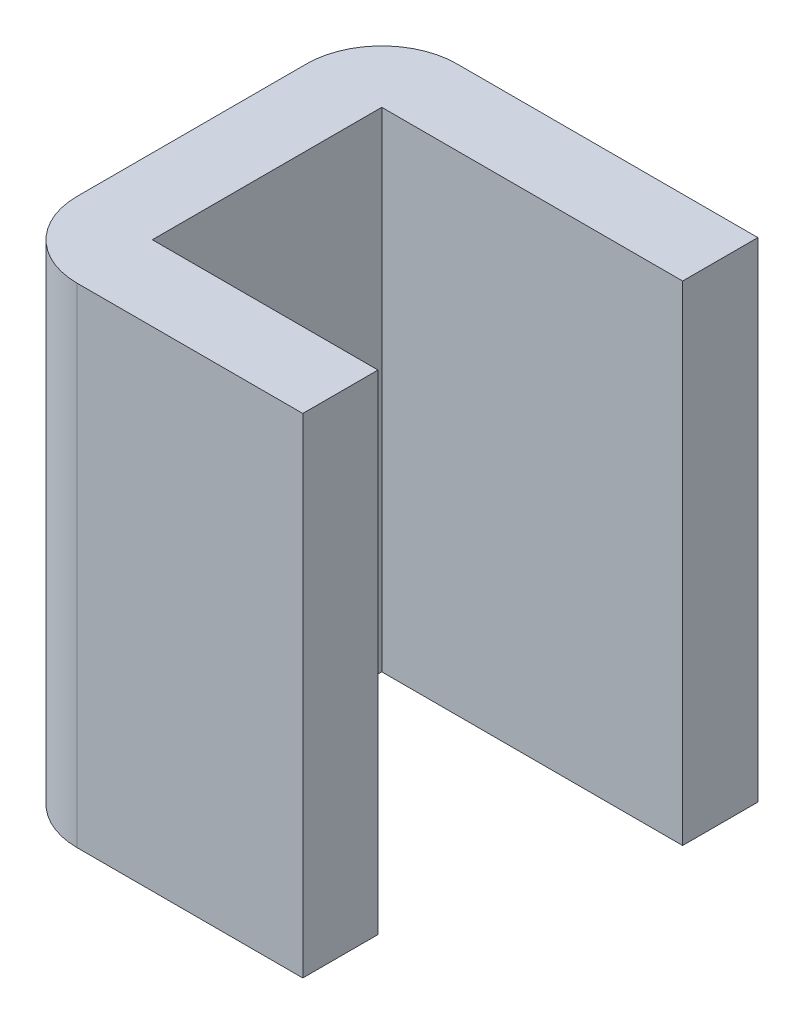
ISO-10303-21;
HEADER;
FILE_DESCRIPTION(('STEP AP214'),'2;1');
FILE_NAME('part.step','',(''),(''),'','','');
FILE_SCHEMA(('AUTOMOTIVE_DESIGN { 1 0 10303 214 1 1 1 1 }'));
ENDSEC;
DATA;
#1=APPLICATION_CONTEXT('core data for automotive mechanical design processes');
#2=APPLICATION_PROTOCOL_DEFINITION('international standard','automotive_design',2000,#1);
#3=PRODUCT_CONTEXT('',#1,'mechanical');
#4=PRODUCT('Part','Part','',(#3));
#5=PRODUCT_RELATED_PRODUCT_CATEGORY('part','',(#4));
#6=PRODUCT_DEFINITION_FORMATION('','',#4);
#7=PRODUCT_DEFINITION_CONTEXT('part definition',#1,'design');
#8=PRODUCT_DEFINITION('design','',#6,#7);
#9=PRODUCT_DEFINITION_SHAPE('','',#8);
#10=(LENGTH_UNIT() NAMED_UNIT(*) SI_UNIT(.MILLI.,.METRE.));
#11=(NAMED_UNIT(*) PLANE_ANGLE_UNIT() SI_UNIT($,.RADIAN.));
#12=(NAMED_UNIT(*) SI_UNIT($,.STERADIAN.) SOLID_ANGLE_UNIT());
#13=UNCERTAINTY_MEASURE_WITH_UNIT(LENGTH_MEASURE(1.E-05),#10,'distance_accuracy_value','');
#14=(GEOMETRIC_REPRESENTATION_CONTEXT(3) GLOBAL_UNCERTAINTY_ASSIGNED_CONTEXT((#13)) GLOBAL_UNIT_ASSIGNED_CONTEXT((#10,
#11,#12)) REPRESENTATION_CONTEXT('',''));
#15=CARTESIAN_POINT('',(0.,0.,0.));
#16=DIRECTION('',(0.,0.,1.));
#17=DIRECTION('',(1.,0.,0.));
#18=AXIS2_PLACEMENT_3D('',#15,#16,#17);
#19=CARTESIAN_POINT('',(-0.825,-0.325,0.505));
#20=DIRECTION('',(0.,0.,1.));
#21=DIRECTION('',(1.,0.,0.));
#22=AXIS2_PLACEMENT_3D('',#19,#20,#21);
#23=PLANE('',#22);
#24=DIRECTION('',(1.,0.,0.));
#25=VECTOR('',#24,1.);
#26=CARTESIAN_POINT('',(-0.625574712644,-0.325,0.505));
#27=LINE('',#26,#25);
#28=CARTESIAN_POINT('',(-0.425,-0.325,0.505));
#29=VERTEX_POINT('',#28);
#30=CARTESIAN_POINT('',(-0.725,-0.325,0.505));
#31=VERTEX_POINT('',#30);
#32=EDGE_CURVE('E191',#29,#31,#27,.F.);
#33=ORIENTED_EDGE('',*,*,#32,.F.);
#34=DIRECTION('',(0.,1.,0.));
#35=VECTOR('',#34,1.);
#36=CARTESIAN_POINT('',(-0.425,-0.325,0.505));
#37=LINE('',#36,#35);
#38=CARTESIAN_POINT('',(-0.425,0.325,0.505));
#39=VERTEX_POINT('',#38);
#40=EDGE_CURVE('E113',#39,#29,#37,.F.);
#41=ORIENTED_EDGE('',*,*,#40,.F.);
#42=DIRECTION('',(-1.,0.,0.));
#43=VECTOR('',#42,1.);
#44=CARTESIAN_POINT('',(-0.625574712644,0.325,0.505));
#45=LINE('',#44,#43);
#46=CARTESIAN_POINT('',(-0.725,0.325,0.505));
#47=VERTEX_POINT('',#46);
#48=EDGE_CURVE('E109',#47,#39,#45,.F.);
#49=ORIENTED_EDGE('',*,*,#48,.F.);
#50=DIRECTION('',(0.,1.,0.));
#51=VECTOR('',#50,1.);
#52=CARTESIAN_POINT('',(-0.725,-0.325,0.505));
#53=LINE('',#52,#51);
#54=EDGE_CURVE('E98',#31,#47,#53,.T.);
#55=ORIENTED_EDGE('',*,*,#54,.F.);
#56=EDGE_LOOP('',(#33,#41,#49,#55));
#57=FACE_BOUND('',#56,.T.);
#58=ADVANCED_FACE('F17',(#57),#23,.T.);
#59=CARTESIAN_POINT('',(-0.725,-0.325,0.405));
#60=DIRECTION('',(0.,1.,0.));
#61=DIRECTION('',(0.,0.,1.));
#62=AXIS2_PLACEMENT_3D('',#59,#60,#61);
#63=CYLINDRICAL_SURFACE('',#62,0.1);
#64=DIRECTION('',(0.,1.,0.));
#65=VECTOR('',#64,1.);
#66=CARTESIAN_POINT('',(-0.825,-0.325,0.405));
#67=LINE('',#66,#65);
#68=CARTESIAN_POINT('',(-0.825,0.325,0.405));
#69=VERTEX_POINT('',#68);
#70=CARTESIAN_POINT('',(-0.825,-0.325,0.405));
#71=VERTEX_POINT('',#70);
#72=EDGE_CURVE('E91',#69,#71,#67,.F.);
#73=ORIENTED_EDGE('',*,*,#72,.T.);
#74=CARTESIAN_POINT('',(-0.725,-0.325,0.405));
#75=DIRECTION('',(0.,1.,0.));
#76=DIRECTION('',(0.,0.,1.));
#77=AXIS2_PLACEMENT_3D('',#74,#75,#76);
#78=CIRCLE('',#77,0.1);
#79=EDGE_CURVE('E101',#31,#71,#78,.F.);
#80=ORIENTED_EDGE('',*,*,#79,.F.);
#81=ORIENTED_EDGE('',*,*,#54,.T.);
#82=CARTESIAN_POINT('',(-0.725,0.325,0.405));
#83=DIRECTION('',(0.,1.,0.));
#84=DIRECTION('',(0.,0.,1.));
#85=AXIS2_PLACEMENT_3D('',#82,#83,#84);
#86=CIRCLE('',#85,0.1);
#87=EDGE_CURVE('E20',#69,#47,#86,.T.);
#88=ORIENTED_EDGE('',*,*,#87,.F.);
#89=EDGE_LOOP('',(#73,#80,#81,#88));
#90=FACE_BOUND('',#89,.T.);
#91=ADVANCED_FACE('F100',(#90),#63,.T.);
#92=CARTESIAN_POINT('',(-0.825,-0.325,0.));
#93=DIRECTION('',(1.,0.,0.));
#94=DIRECTION('',(0.,0.,-1.));
#95=AXIS2_PLACEMENT_3D('',#92,#93,#94);
#96=PLANE('',#95);
#97=DIRECTION('',(0.,0.,1.));
#98=VECTOR('',#97,1.);
#99=CARTESIAN_POINT('',(-0.825,0.325,0.236982758621));
#100=LINE('',#99,#98);
#101=CARTESIAN_POINT('',(-0.825,0.325,0.1));
#102=VERTEX_POINT('',#101);
#103=EDGE_CURVE('E112',#102,#69,#100,.T.);
#104=ORIENTED_EDGE('',*,*,#103,.F.);
#105=DIRECTION('',(0.,1.,0.));
#106=VECTOR('',#105,1.);
#107=CARTESIAN_POINT('',(-0.825,-0.325,0.1));
#108=LINE('',#107,#106);
#109=CARTESIAN_POINT('',(-0.825,-0.325,0.1));
#110=VERTEX_POINT('',#109);
#111=EDGE_CURVE('E135',#110,#102,#108,.T.);
#112=ORIENTED_EDGE('',*,*,#111,.F.);
#113=DIRECTION('',(0.,0.,1.));
#114=VECTOR('',#113,1.);
#115=CARTESIAN_POINT('',(-0.825,-0.325,0.236982758621));
#116=LINE('',#115,#114);
#117=EDGE_CURVE('E190',#71,#110,#116,.F.);
#118=ORIENTED_EDGE('',*,*,#117,.F.);
#119=ORIENTED_EDGE('',*,*,#72,.F.);
#120=EDGE_LOOP('',(#104,#112,#118,#119));
#121=FACE_BOUND('',#120,.T.);
#122=ADVANCED_FACE('F221',(#121),#96,.F.);
#123=CARTESIAN_POINT('',(-0.725,-0.325,0.));
#124=DIRECTION('',(1.,0.,0.));
#125=DIRECTION('',(0.,0.,-1.));
#126=AXIS2_PLACEMENT_3D('',#123,#124,#125);
#127=PLANE('',#126);
#128=DIRECTION('',(0.,0.,1.));
#129=VECTOR('',#128,1.);
#130=CARTESIAN_POINT('',(-0.725,0.325,0.236982758621));
#131=LINE('',#130,#129);
#132=CARTESIAN_POINT('',(-0.725,0.325,0.405));
#133=VERTEX_POINT('',#132);
#134=CARTESIAN_POINT('',(-0.725,0.325,0.1));
#135=VERTEX_POINT('',#134);
#136=EDGE_CURVE('E136',#133,#135,#131,.F.);
#137=ORIENTED_EDGE('',*,*,#136,.F.);
#138=DIRECTION('',(0.,1.,0.));
#139=VECTOR('',#138,1.);
#140=CARTESIAN_POINT('',(-0.725,-0.325,0.405));
#141=LINE('',#140,#139);
#142=CARTESIAN_POINT('',(-0.725,-0.325,0.405));
#143=VERTEX_POINT('',#142);
#144=EDGE_CURVE('E159',#133,#143,#141,.F.);
#145=ORIENTED_EDGE('',*,*,#144,.T.);
#146=DIRECTION('',(0.,0.,1.));
#147=VECTOR('',#146,1.);
#148=CARTESIAN_POINT('',(-0.725,-0.325,0.236982758621));
#149=LINE('',#148,#147);
#150=CARTESIAN_POINT('',(-0.725,-0.325,0.1));
#151=VERTEX_POINT('',#150);
#152=EDGE_CURVE('E146',#151,#143,#149,.T.);
#153=ORIENTED_EDGE('',*,*,#152,.F.);
#154=DIRECTION('',(0.,1.,0.));
#155=VECTOR('',#154,1.);
#156=CARTESIAN_POINT('',(-0.725,-0.325,0.1));
#157=LINE('',#156,#155);
#158=EDGE_CURVE('E126',#135,#151,#157,.F.);
#159=ORIENTED_EDGE('',*,*,#158,.F.);
#160=EDGE_LOOP('',(#137,#145,#153,#159));
#161=FACE_BOUND('',#160,.T.);
#162=ADVANCED_FACE('F223',(#161),#127,.T.);
#163=CARTESIAN_POINT('',(-0.825,-0.325,0.405));
#164=DIRECTION('',(0.,0.,1.));
#165=DIRECTION('',(1.,0.,0.));
#166=AXIS2_PLACEMENT_3D('',#163,#164,#165);
#167=PLANE('',#166);
#168=DIRECTION('',(1.,0.,0.));
#169=VECTOR('',#168,1.);
#170=CARTESIAN_POINT('',(-0.625574712644,-0.325,0.405));
#171=LINE('',#170,#169);
#172=CARTESIAN_POINT('',(-0.425,-0.325,0.405));
#173=VERTEX_POINT('',#172);
#174=EDGE_CURVE('E154',#143,#173,#171,.T.);
#175=ORIENTED_EDGE('',*,*,#174,.F.);
#176=ORIENTED_EDGE('',*,*,#144,.F.);
#177=DIRECTION('',(-1.,0.,0.));
#178=VECTOR('',#177,1.);
#179=CARTESIAN_POINT('',(-0.625574712644,0.325,0.405));
#180=LINE('',#179,#178);
#181=CARTESIAN_POINT('',(-0.425,0.325,0.405));
#182=VERTEX_POINT('',#181);
#183=EDGE_CURVE('E117',#182,#133,#180,.T.);
#184=ORIENTED_EDGE('',*,*,#183,.F.);
#185=DIRECTION('',(0.,1.,0.));
#186=VECTOR('',#185,1.);
#187=CARTESIAN_POINT('',(-0.425,-0.325,0.405));
#188=LINE('',#187,#186);
#189=EDGE_CURVE('E167',#173,#182,#188,.T.);
#190=ORIENTED_EDGE('',*,*,#189,.F.);
#191=EDGE_LOOP('',(#175,#176,#184,#190));
#192=FACE_BOUND('',#191,.T.);
#193=ADVANCED_FACE('F230',(#192),#167,.F.);
#194=CARTESIAN_POINT('',(-0.425,-0.325,0.405));
#195=DIRECTION('',(1.,0.,0.));
#196=DIRECTION('',(0.,0.,-1.));
#197=AXIS2_PLACEMENT_3D('',#194,#195,#196);
#198=PLANE('',#197);
#199=DIRECTION('',(0.,0.,1.));
#200=VECTOR('',#199,1.);
#201=CARTESIAN_POINT('',(-0.425,0.325,0.236982758621));
#202=LINE('',#201,#200);
#203=EDGE_CURVE('E115',#39,#182,#202,.F.);
#204=ORIENTED_EDGE('',*,*,#203,.F.);
#205=ORIENTED_EDGE('',*,*,#40,.T.);
#206=DIRECTION('',(0.,0.,1.));
#207=VECTOR('',#206,1.);
#208=CARTESIAN_POINT('',(-0.425,-0.325,0.236982758621));
#209=LINE('',#208,#207);
#210=EDGE_CURVE('E161',#173,#29,#209,.T.);
#211=ORIENTED_EDGE('',*,*,#210,.F.);
#212=ORIENTED_EDGE('',*,*,#189,.T.);
#213=EDGE_LOOP('',(#204,#205,#211,#212));
#214=FACE_BOUND('',#213,.T.);
#215=ADVANCED_FACE('F250',(#214),#198,.T.);
#216=CARTESIAN_POINT('',(-0.825,-0.325,0.1));
#217=DIRECTION('',(0.,0.,1.));
#218=DIRECTION('',(1.,0.,0.));
#219=AXIS2_PLACEMENT_3D('',#216,#217,#218);
#220=PLANE('',#219);
#221=DIRECTION('',(1.,0.,0.));
#222=VECTOR('',#221,1.);
#223=CARTESIAN_POINT('',(-0.625574712644,-0.325,0.1));
#224=LINE('',#223,#222);
#225=CARTESIAN_POINT('',(-0.325,-0.325,0.1));
#226=VERTEX_POINT('',#225);
#227=EDGE_CURVE('E143',#226,#151,#224,.F.);
#228=ORIENTED_EDGE('',*,*,#227,.F.);
#229=DIRECTION('',(0.,1.,0.));
#230=VECTOR('',#229,1.);
#231=CARTESIAN_POINT('',(-0.325,-0.325,0.1));
#232=LINE('',#231,#230);
#233=CARTESIAN_POINT('',(-0.325,0.325,0.1));
#234=VERTEX_POINT('',#233);
#235=EDGE_CURVE('E130',#234,#226,#232,.F.);
#236=ORIENTED_EDGE('',*,*,#235,.F.);
#237=DIRECTION('',(-1.,0.,0.));
#238=VECTOR('',#237,1.);
#239=CARTESIAN_POINT('',(-0.625574712644,0.325,0.1));
#240=LINE('',#239,#238);
#241=EDGE_CURVE('E133',#135,#234,#240,.F.);
#242=ORIENTED_EDGE('',*,*,#241,.F.);
#243=ORIENTED_EDGE('',*,*,#158,.T.);
#244=EDGE_LOOP('',(#228,#236,#242,#243));
#245=FACE_BOUND('',#244,.T.);
#246=ADVANCED_FACE('F247',(#245),#220,.T.);
#247=CARTESIAN_POINT('',(-0.625574712644,0.325,0.236982758621));
#248=DIRECTION('',(0.,1.,0.));
#249=DIRECTION('',(-1.,0.,0.));
#250=AXIS2_PLACEMENT_3D('',#247,#248,#249);
#251=PLANE('',#250);
#252=ORIENTED_EDGE('',*,*,#241,.T.);
#253=DIRECTION('',(0.,0.,-1.));
#254=VECTOR('',#253,1.);
#255=CARTESIAN_POINT('',(-0.325,0.325,0.));
#256=LINE('',#255,#254);
#257=CARTESIAN_POINT('',(-0.325,0.325,0.));
#258=VERTEX_POINT('',#257);
#259=EDGE_CURVE('E127',#258,#234,#256,.F.);
#260=ORIENTED_EDGE('',*,*,#259,.F.);
#261=DIRECTION('',(1.,0.,0.));
#262=VECTOR('',#261,1.);
#263=CARTESIAN_POINT('',(-0.825,0.325,0.));
#264=LINE('',#263,#262);
#265=CARTESIAN_POINT('',(-0.725,0.325,0.));
#266=VERTEX_POINT('',#265);
#267=EDGE_CURVE('E140',#258,#266,#264,.F.);
#268=ORIENTED_EDGE('',*,*,#267,.T.);
#269=CARTESIAN_POINT('',(-0.725,0.325,0.1));
#270=DIRECTION('',(0.,1.,0.));
#271=DIRECTION('',(0.,0.,1.));
#272=AXIS2_PLACEMENT_3D('',#269,#270,#271);
#273=CIRCLE('',#272,0.1);
#274=EDGE_CURVE('E158',#102,#266,#273,.F.);
#275=ORIENTED_EDGE('',*,*,#274,.F.);
#276=ORIENTED_EDGE('',*,*,#103,.T.);
#277=ORIENTED_EDGE('',*,*,#87,.T.);
#278=ORIENTED_EDGE('',*,*,#48,.T.);
#279=ORIENTED_EDGE('',*,*,#203,.T.);
#280=ORIENTED_EDGE('',*,*,#183,.T.);
#281=ORIENTED_EDGE('',*,*,#136,.T.);
#282=EDGE_LOOP('',(#252,#260,#268,#275,#276,#277,#278,#279,#280,#281));
#283=FACE_BOUND('',#282,.T.);
#284=ADVANCED_FACE('F107',(#283),#251,.T.);
#285=CARTESIAN_POINT('',(-0.725,-0.325,0.1));
#286=DIRECTION('',(0.,1.,0.));
#287=DIRECTION('',(0.,0.,1.));
#288=AXIS2_PLACEMENT_3D('',#285,#286,#287);
#289=CYLINDRICAL_SURFACE('',#288,0.1);
#290=DIRECTION('',(0.,1.,0.));
#291=VECTOR('',#290,1.);
#292=CARTESIAN_POINT('',(-0.725,-0.325,0.));
#293=LINE('',#292,#291);
#294=CARTESIAN_POINT('',(-0.725,-0.325,0.));
#295=VERTEX_POINT('',#294);
#296=EDGE_CURVE('E201',#266,#295,#293,.F.);
#297=ORIENTED_EDGE('',*,*,#296,.T.);
#298=CARTESIAN_POINT('',(-0.725,-0.325,0.1));
#299=DIRECTION('',(0.,1.,0.));
#300=DIRECTION('',(0.,0.,1.));
#301=AXIS2_PLACEMENT_3D('',#298,#299,#300);
#302=CIRCLE('',#301,0.1);
#303=EDGE_CURVE('E147',#110,#295,#302,.F.);
#304=ORIENTED_EDGE('',*,*,#303,.F.);
#305=ORIENTED_EDGE('',*,*,#111,.T.);
#306=ORIENTED_EDGE('',*,*,#274,.T.);
#307=EDGE_LOOP('',(#297,#304,#305,#306));
#308=FACE_BOUND('',#307,.T.);
#309=ADVANCED_FACE('F218',(#308),#289,.T.);
#310=CARTESIAN_POINT('',(-0.625574712644,-0.325,0.236982758621));
#311=DIRECTION('',(0.,-1.,0.));
#312=DIRECTION('',(1.,0.,0.));
#313=AXIS2_PLACEMENT_3D('',#310,#311,#312);
#314=PLANE('',#313);
#315=ORIENTED_EDGE('',*,*,#174,.T.);
#316=ORIENTED_EDGE('',*,*,#210,.T.);
#317=ORIENTED_EDGE('',*,*,#32,.T.);
#318=ORIENTED_EDGE('',*,*,#79,.T.);
#319=ORIENTED_EDGE('',*,*,#117,.T.);
#320=ORIENTED_EDGE('',*,*,#303,.T.);
#321=DIRECTION('',(1.,0.,0.));
#322=VECTOR('',#321,1.);
#323=CARTESIAN_POINT('',(-0.825,-0.325,0.));
#324=LINE('',#323,#322);
#325=CARTESIAN_POINT('',(-0.325,-0.325,0.));
#326=VERTEX_POINT('',#325);
#327=EDGE_CURVE('E26',#295,#326,#324,.T.);
#328=ORIENTED_EDGE('',*,*,#327,.T.);
#329=DIRECTION('',(0.,0.,-1.));
#330=VECTOR('',#329,1.);
#331=CARTESIAN_POINT('',(-0.325,-0.325,0.));
#332=LINE('',#331,#330);
#333=EDGE_CURVE('E34',#226,#326,#332,.T.);
#334=ORIENTED_EDGE('',*,*,#333,.F.);
#335=ORIENTED_EDGE('',*,*,#227,.T.);
#336=ORIENTED_EDGE('',*,*,#152,.T.);
#337=EDGE_LOOP('',(#315,#316,#317,#318,#319,#320,#328,#334,#335,#336));
#338=FACE_BOUND('',#337,.T.);
#339=ADVANCED_FACE('F220',(#338),#314,.T.);
#340=CARTESIAN_POINT('',(-0.325,-0.325,0.));
#341=DIRECTION('',(1.,0.,0.));
#342=DIRECTION('',(0.,0.,-1.));
#343=AXIS2_PLACEMENT_3D('',#340,#341,#342);
#344=PLANE('',#343);
#345=ORIENTED_EDGE('',*,*,#259,.T.);
#346=ORIENTED_EDGE('',*,*,#235,.T.);
#347=ORIENTED_EDGE('',*,*,#333,.T.);
#348=DIRECTION('',(0.,1.,0.));
#349=VECTOR('',#348,1.);
#350=CARTESIAN_POINT('',(-0.325,-0.325,0.));
#351=LINE('',#350,#349);
#352=EDGE_CURVE('E11',#326,#258,#351,.T.);
#353=ORIENTED_EDGE('',*,*,#352,.T.);
#354=EDGE_LOOP('',(#345,#346,#347,#353));
#355=FACE_BOUND('',#354,.T.);
#356=ADVANCED_FACE('F234',(#355),#344,.T.);
#357=CARTESIAN_POINT('',(-0.825,-0.325,0.));
#358=DIRECTION('',(0.,0.,1.));
#359=DIRECTION('',(1.,0.,0.));
#360=AXIS2_PLACEMENT_3D('',#357,#358,#359);
#361=PLANE('',#360);
#362=ORIENTED_EDGE('',*,*,#327,.F.);
#363=ORIENTED_EDGE('',*,*,#296,.F.);
#364=ORIENTED_EDGE('',*,*,#267,.F.);
#365=ORIENTED_EDGE('',*,*,#352,.F.);
#366=EDGE_LOOP('',(#362,#363,#364,#365));
#367=FACE_BOUND('',#366,.T.);
#368=ADVANCED_FACE('F216',(#367),#361,.F.);
#369=CLOSED_SHELL('',(#58,#91,#122,#162,#193,#215,#246,#284,#309,#339,#356,#368));
#370=MANIFOLD_SOLID_BREP('B1',#369);
#371=ADVANCED_BREP_SHAPE_REPRESENTATION('',(#18,#370),#14);
#372=SHAPE_DEFINITION_REPRESENTATION(#9,#371);
ENDSEC;
END-ISO-10303-21;
